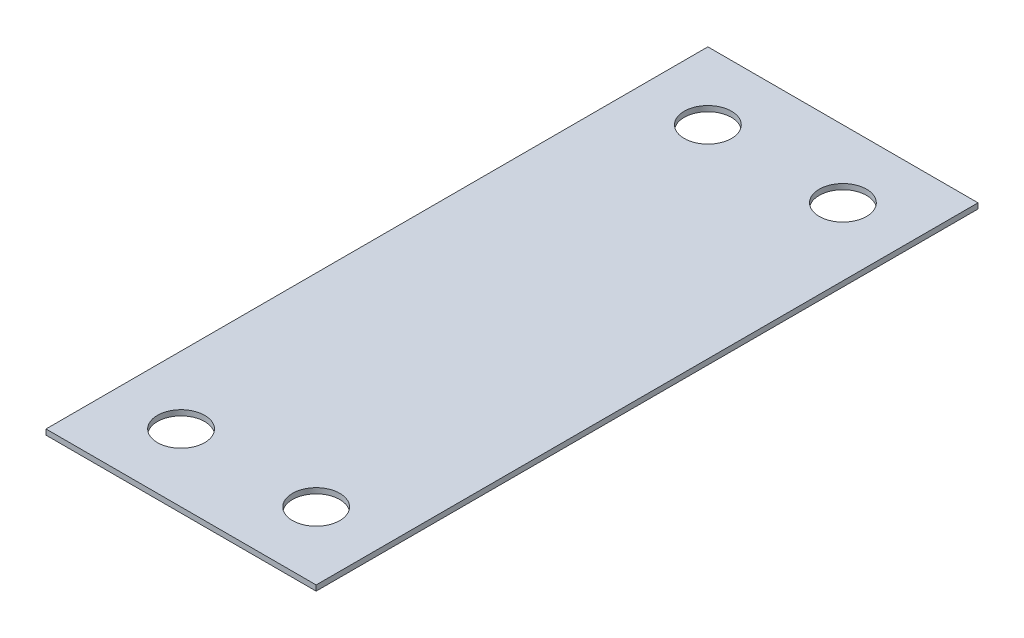
ISO-10303-21;
HEADER;
FILE_DESCRIPTION(('STEP AP214'),'2;1');
FILE_NAME('part.step','',(''),(''),'','','');
FILE_SCHEMA(('AUTOMOTIVE_DESIGN { 1 0 10303 214 1 1 1 1 }'));
ENDSEC;
DATA;
#1=APPLICATION_CONTEXT('core data for automotive mechanical design processes');
#2=APPLICATION_PROTOCOL_DEFINITION('international standard','automotive_design',2000,#1);
#3=PRODUCT_CONTEXT('',#1,'mechanical');
#4=PRODUCT('Part','Part','',(#3));
#5=PRODUCT_RELATED_PRODUCT_CATEGORY('part','',(#4));
#6=PRODUCT_DEFINITION_FORMATION('','',#4);
#7=PRODUCT_DEFINITION_CONTEXT('part definition',#1,'design');
#8=PRODUCT_DEFINITION('design','',#6,#7);
#9=PRODUCT_DEFINITION_SHAPE('','',#8);
#10=(LENGTH_UNIT() NAMED_UNIT(*) SI_UNIT(.MILLI.,.METRE.));
#11=(NAMED_UNIT(*) PLANE_ANGLE_UNIT() SI_UNIT($,.RADIAN.));
#12=(NAMED_UNIT(*) SI_UNIT($,.STERADIAN.) SOLID_ANGLE_UNIT());
#13=UNCERTAINTY_MEASURE_WITH_UNIT(LENGTH_MEASURE(1.E-05),#10,'distance_accuracy_value','');
#14=(GEOMETRIC_REPRESENTATION_CONTEXT(3) GLOBAL_UNCERTAINTY_ASSIGNED_CONTEXT((#13)) GLOBAL_UNIT_ASSIGNED_CONTEXT((#10,
#11,#12)) REPRESENTATION_CONTEXT('',''));
#15=CARTESIAN_POINT('',(0.,0.,0.));
#16=DIRECTION('',(0.,0.,1.));
#17=DIRECTION('',(1.,0.,0.));
#18=AXIS2_PLACEMENT_3D('',#15,#16,#17);
#19=CARTESIAN_POINT('',(0.,0.4,0.));
#20=DIRECTION('',(0.,1.,0.));
#21=DIRECTION('',(0.,0.,1.));
#22=AXIS2_PLACEMENT_3D('',#19,#20,#21);
#23=PLANE('',#22);
#24=CARTESIAN_POINT('',(15.,0.4,-5.));
#25=DIRECTION('',(0.,1.,0.));
#26=DIRECTION('',(0.,0.,1.));
#27=AXIS2_PLACEMENT_3D('',#24,#25,#26);
#28=CIRCLE('',#27,1.75);
#29=CARTESIAN_POINT('',(15.,0.4,-3.25));
#30=VERTEX_POINT('',#29);
#31=EDGE_CURVE('E127',#30,#30,#28,.T.);
#32=ORIENTED_EDGE('',*,*,#31,.F.);
#33=EDGE_LOOP('',(#32));
#34=FACE_BOUND('',#33,.T.);
#35=CARTESIAN_POINT('',(5.,0.4,-44.));
#36=DIRECTION('',(0.,1.,0.));
#37=DIRECTION('',(0.,0.,1.));
#38=AXIS2_PLACEMENT_3D('',#35,#36,#37);
#39=CIRCLE('',#38,1.75);
#40=CARTESIAN_POINT('',(5.,0.4,-42.25));
#41=VERTEX_POINT('',#40);
#42=EDGE_CURVE('E106',#41,#41,#39,.T.);
#43=ORIENTED_EDGE('',*,*,#42,.F.);
#44=EDGE_LOOP('',(#43));
#45=FACE_BOUND('',#44,.T.);
#46=DIRECTION('',(0.,0.,1.));
#47=VECTOR('',#46,1.);
#48=CARTESIAN_POINT('',(0.,0.4,-49.));
#49=LINE('',#48,#47);
#50=CARTESIAN_POINT('',(0.,0.4,-49.));
#51=VERTEX_POINT('',#50);
#52=CARTESIAN_POINT('',(0.,0.4,0.));
#53=VERTEX_POINT('',#52);
#54=EDGE_CURVE('E90',#51,#53,#49,.T.);
#55=ORIENTED_EDGE('',*,*,#54,.T.);
#56=DIRECTION('',(1.,0.,0.));
#57=VECTOR('',#56,1.);
#58=CARTESIAN_POINT('',(0.,0.4,0.));
#59=LINE('',#58,#57);
#60=CARTESIAN_POINT('',(20.,0.4,0.));
#61=VERTEX_POINT('',#60);
#62=EDGE_CURVE('E85',#53,#61,#59,.T.);
#63=ORIENTED_EDGE('',*,*,#62,.T.);
#64=DIRECTION('',(0.,0.,-1.));
#65=VECTOR('',#64,1.);
#66=CARTESIAN_POINT('',(20.,0.4,0.));
#67=LINE('',#66,#65);
#68=CARTESIAN_POINT('',(20.,0.4,-49.));
#69=VERTEX_POINT('',#68);
#70=EDGE_CURVE('E88',#61,#69,#67,.T.);
#71=ORIENTED_EDGE('',*,*,#70,.T.);
#72=DIRECTION('',(-1.,0.,0.));
#73=VECTOR('',#72,1.);
#74=CARTESIAN_POINT('',(20.,0.4,-49.));
#75=LINE('',#74,#73);
#76=EDGE_CURVE('E56',#69,#51,#75,.T.);
#77=ORIENTED_EDGE('',*,*,#76,.T.);
#78=EDGE_LOOP('',(#55,#63,#71,#77));
#79=FACE_BOUND('',#78,.T.);
#80=CARTESIAN_POINT('',(15.,0.4,-44.));
#81=DIRECTION('',(0.,1.,0.));
#82=DIRECTION('',(0.,0.,1.));
#83=AXIS2_PLACEMENT_3D('',#80,#81,#82);
#84=CIRCLE('',#83,1.75);
#85=CARTESIAN_POINT('',(15.,0.4,-42.25));
#86=VERTEX_POINT('',#85);
#87=EDGE_CURVE('E121',#86,#86,#84,.T.);
#88=ORIENTED_EDGE('',*,*,#87,.F.);
#89=EDGE_LOOP('',(#88));
#90=FACE_BOUND('',#89,.T.);
#91=CARTESIAN_POINT('',(5.00000000000001,0.4,-5.));
#92=DIRECTION('',(0.,1.,0.));
#93=DIRECTION('',(0.,0.,1.));
#94=AXIS2_PLACEMENT_3D('',#91,#92,#93);
#95=CIRCLE('',#94,1.75);
#96=CARTESIAN_POINT('',(5.00000000000001,0.4,-3.25));
#97=VERTEX_POINT('',#96);
#98=EDGE_CURVE('E133',#97,#97,#95,.T.);
#99=ORIENTED_EDGE('',*,*,#98,.F.);
#100=EDGE_LOOP('',(#99));
#101=FACE_BOUND('',#100,.T.);
#102=ADVANCED_FACE('F39',(#34,#45,#79,#90,#101),#23,.T.);
#103=CARTESIAN_POINT('',(0.,0.,0.));
#104=DIRECTION('',(0.,1.,0.));
#105=DIRECTION('',(0.,0.,1.));
#106=AXIS2_PLACEMENT_3D('',#103,#104,#105);
#107=PLANE('',#106);
#108=DIRECTION('',(0.,0.,1.));
#109=VECTOR('',#108,1.);
#110=CARTESIAN_POINT('',(0.,0.,-49.));
#111=LINE('',#110,#109);
#112=CARTESIAN_POINT('',(0.,0.,-49.));
#113=VERTEX_POINT('',#112);
#114=CARTESIAN_POINT('',(0.,0.,0.));
#115=VERTEX_POINT('',#114);
#116=EDGE_CURVE('E103',#113,#115,#111,.T.);
#117=ORIENTED_EDGE('',*,*,#116,.F.);
#118=DIRECTION('',(-1.,0.,0.));
#119=VECTOR('',#118,1.);
#120=CARTESIAN_POINT('',(20.,0.,-49.));
#121=LINE('',#120,#119);
#122=CARTESIAN_POINT('',(20.,0.,-49.));
#123=VERTEX_POINT('',#122);
#124=EDGE_CURVE('E78',#123,#113,#121,.T.);
#125=ORIENTED_EDGE('',*,*,#124,.F.);
#126=DIRECTION('',(0.,0.,-1.));
#127=VECTOR('',#126,1.);
#128=CARTESIAN_POINT('',(20.,0.,-35.));
#129=LINE('',#128,#127);
#130=CARTESIAN_POINT('',(20.,0.,0.));
#131=VERTEX_POINT('',#130);
#132=EDGE_CURVE('E72',#131,#123,#129,.T.);
#133=ORIENTED_EDGE('',*,*,#132,.F.);
#134=DIRECTION('',(1.,0.,0.));
#135=VECTOR('',#134,1.);
#136=CARTESIAN_POINT('',(0.,0.,0.));
#137=LINE('',#136,#135);
#138=EDGE_CURVE('E95',#115,#131,#137,.T.);
#139=ORIENTED_EDGE('',*,*,#138,.F.);
#140=EDGE_LOOP('',(#117,#125,#133,#139));
#141=FACE_BOUND('',#140,.T.);
#142=CARTESIAN_POINT('',(5.,0.,-44.));
#143=DIRECTION('',(0.,1.,0.));
#144=DIRECTION('',(0.,0.,1.));
#145=AXIS2_PLACEMENT_3D('',#142,#143,#144);
#146=CIRCLE('',#145,1.75);
#147=CARTESIAN_POINT('',(5.,0.,-42.25));
#148=VERTEX_POINT('',#147);
#149=EDGE_CURVE('E118',#148,#148,#146,.T.);
#150=ORIENTED_EDGE('',*,*,#149,.T.);
#151=EDGE_LOOP('',(#150));
#152=FACE_BOUND('',#151,.T.);
#153=CARTESIAN_POINT('',(15.,0.,-44.));
#154=DIRECTION('',(0.,1.,0.));
#155=DIRECTION('',(0.,0.,1.));
#156=AXIS2_PLACEMENT_3D('',#153,#154,#155);
#157=CIRCLE('',#156,1.75);
#158=CARTESIAN_POINT('',(15.,0.,-42.25));
#159=VERTEX_POINT('',#158);
#160=EDGE_CURVE('E124',#159,#159,#157,.T.);
#161=ORIENTED_EDGE('',*,*,#160,.T.);
#162=EDGE_LOOP('',(#161));
#163=FACE_BOUND('',#162,.T.);
#164=CARTESIAN_POINT('',(15.,0.,-5.));
#165=DIRECTION('',(0.,1.,0.));
#166=DIRECTION('',(0.,0.,1.));
#167=AXIS2_PLACEMENT_3D('',#164,#165,#166);
#168=CIRCLE('',#167,1.75);
#169=CARTESIAN_POINT('',(15.,0.,-3.25));
#170=VERTEX_POINT('',#169);
#171=EDGE_CURVE('E130',#170,#170,#168,.T.);
#172=ORIENTED_EDGE('',*,*,#171,.T.);
#173=EDGE_LOOP('',(#172));
#174=FACE_BOUND('',#173,.T.);
#175=CARTESIAN_POINT('',(5.00000000000001,0.,-5.));
#176=DIRECTION('',(0.,1.,0.));
#177=DIRECTION('',(0.,0.,1.));
#178=AXIS2_PLACEMENT_3D('',#175,#176,#177);
#179=CIRCLE('',#178,1.75);
#180=CARTESIAN_POINT('',(5.00000000000001,0.,-3.25));
#181=VERTEX_POINT('',#180);
#182=EDGE_CURVE('E136',#181,#181,#179,.T.);
#183=ORIENTED_EDGE('',*,*,#182,.T.);
#184=EDGE_LOOP('',(#183));
#185=FACE_BOUND('',#184,.T.);
#186=ADVANCED_FACE('F114',(#141,#152,#163,#174,#185),#107,.F.);
#187=CARTESIAN_POINT('',(0.,0.4,-49.));
#188=DIRECTION('',(1.,0.,0.));
#189=DIRECTION('',(0.,0.,-1.));
#190=AXIS2_PLACEMENT_3D('',#187,#188,#189);
#191=PLANE('',#190);
#192=ORIENTED_EDGE('',*,*,#116,.T.);
#193=DIRECTION('',(0.,-1.,0.));
#194=VECTOR('',#193,1.);
#195=CARTESIAN_POINT('',(0.,0.4,0.));
#196=LINE('',#195,#194);
#197=EDGE_CURVE('E11',#53,#115,#196,.T.);
#198=ORIENTED_EDGE('',*,*,#197,.F.);
#199=ORIENTED_EDGE('',*,*,#54,.F.);
#200=DIRECTION('',(0.,-1.,0.));
#201=VECTOR('',#200,1.);
#202=CARTESIAN_POINT('',(0.,0.4,-49.));
#203=LINE('',#202,#201);
#204=EDGE_CURVE('E99',#51,#113,#203,.T.);
#205=ORIENTED_EDGE('',*,*,#204,.T.);
#206=EDGE_LOOP('',(#192,#198,#199,#205));
#207=FACE_BOUND('',#206,.T.);
#208=ADVANCED_FACE('F41',(#207),#191,.F.);
#209=CARTESIAN_POINT('',(0.,0.4,0.));
#210=DIRECTION('',(0.,0.,-1.));
#211=DIRECTION('',(-1.,0.,0.));
#212=AXIS2_PLACEMENT_3D('',#209,#210,#211);
#213=PLANE('',#212);
#214=ORIENTED_EDGE('',*,*,#138,.T.);
#215=DIRECTION('',(0.,-1.,0.));
#216=VECTOR('',#215,1.);
#217=CARTESIAN_POINT('',(20.,0.4,0.));
#218=LINE('',#217,#216);
#219=EDGE_CURVE('E48',#61,#131,#218,.T.);
#220=ORIENTED_EDGE('',*,*,#219,.F.);
#221=ORIENTED_EDGE('',*,*,#62,.F.);
#222=ORIENTED_EDGE('',*,*,#197,.T.);
#223=EDGE_LOOP('',(#214,#220,#221,#222));
#224=FACE_BOUND('',#223,.T.);
#225=ADVANCED_FACE('F94',(#224),#213,.F.);
#226=CARTESIAN_POINT('',(20.,0.4,-35.));
#227=DIRECTION('',(-1.,0.,0.));
#228=DIRECTION('',(0.,0.,1.));
#229=AXIS2_PLACEMENT_3D('',#226,#227,#228);
#230=PLANE('',#229);
#231=ORIENTED_EDGE('',*,*,#132,.T.);
#232=DIRECTION('',(0.,-1.,0.));
#233=VECTOR('',#232,1.);
#234=CARTESIAN_POINT('',(20.,0.4,-49.));
#235=LINE('',#234,#233);
#236=EDGE_CURVE('E96',#69,#123,#235,.T.);
#237=ORIENTED_EDGE('',*,*,#236,.F.);
#238=ORIENTED_EDGE('',*,*,#70,.F.);
#239=ORIENTED_EDGE('',*,*,#219,.T.);
#240=EDGE_LOOP('',(#231,#237,#238,#239));
#241=FACE_BOUND('',#240,.T.);
#242=ADVANCED_FACE('F97',(#241),#230,.F.);
#243=CARTESIAN_POINT('',(20.,0.4,-49.));
#244=DIRECTION('',(0.,0.,1.));
#245=DIRECTION('',(1.,0.,0.));
#246=AXIS2_PLACEMENT_3D('',#243,#244,#245);
#247=PLANE('',#246);
#248=ORIENTED_EDGE('',*,*,#124,.T.);
#249=ORIENTED_EDGE('',*,*,#204,.F.);
#250=ORIENTED_EDGE('',*,*,#76,.F.);
#251=ORIENTED_EDGE('',*,*,#236,.T.);
#252=EDGE_LOOP('',(#248,#249,#250,#251));
#253=FACE_BOUND('',#252,.T.);
#254=ADVANCED_FACE('F111',(#253),#247,.F.);
#255=CARTESIAN_POINT('',(5.,0.4,-44.));
#256=DIRECTION('',(0.,-1.,0.));
#257=DIRECTION('',(0.,0.,-1.));
#258=AXIS2_PLACEMENT_3D('',#255,#256,#257);
#259=CYLINDRICAL_SURFACE('',#258,1.75);
#260=ORIENTED_EDGE('',*,*,#42,.T.);
#261=EDGE_LOOP('',(#260));
#262=FACE_BOUND('',#261,.T.);
#263=ORIENTED_EDGE('',*,*,#149,.F.);
#264=EDGE_LOOP('',(#263));
#265=FACE_BOUND('',#264,.T.);
#266=ADVANCED_FACE('F155',(#262,#265),#259,.F.);
#267=CARTESIAN_POINT('',(15.,0.4,-44.));
#268=DIRECTION('',(0.,-1.,0.));
#269=DIRECTION('',(0.,0.,-1.));
#270=AXIS2_PLACEMENT_3D('',#267,#268,#269);
#271=CYLINDRICAL_SURFACE('',#270,1.75);
#272=ORIENTED_EDGE('',*,*,#87,.T.);
#273=EDGE_LOOP('',(#272));
#274=FACE_BOUND('',#273,.T.);
#275=ORIENTED_EDGE('',*,*,#160,.F.);
#276=EDGE_LOOP('',(#275));
#277=FACE_BOUND('',#276,.T.);
#278=ADVANCED_FACE('F202',(#274,#277),#271,.F.);
#279=CARTESIAN_POINT('',(15.,0.4,-5.));
#280=DIRECTION('',(0.,-1.,0.));
#281=DIRECTION('',(0.,0.,-1.));
#282=AXIS2_PLACEMENT_3D('',#279,#280,#281);
#283=CYLINDRICAL_SURFACE('',#282,1.75);
#284=ORIENTED_EDGE('',*,*,#31,.T.);
#285=EDGE_LOOP('',(#284));
#286=FACE_BOUND('',#285,.T.);
#287=ORIENTED_EDGE('',*,*,#171,.F.);
#288=EDGE_LOOP('',(#287));
#289=FACE_BOUND('',#288,.T.);
#290=ADVANCED_FACE('F210',(#286,#289),#283,.F.);
#291=CARTESIAN_POINT('',(5.00000000000001,0.4,-5.));
#292=DIRECTION('',(0.,-1.,0.));
#293=DIRECTION('',(0.,0.,-1.));
#294=AXIS2_PLACEMENT_3D('',#291,#292,#293);
#295=CYLINDRICAL_SURFACE('',#294,1.75);
#296=ORIENTED_EDGE('',*,*,#98,.T.);
#297=EDGE_LOOP('',(#296));
#298=FACE_BOUND('',#297,.T.);
#299=ORIENTED_EDGE('',*,*,#182,.F.);
#300=EDGE_LOOP('',(#299));
#301=FACE_BOUND('',#300,.T.);
#302=ADVANCED_FACE('F142',(#298,#301),#295,.F.);
#303=CLOSED_SHELL('',(#102,#186,#208,#225,#242,#254,#266,#278,#290,#302));
#304=MANIFOLD_SOLID_BREP('B2',#303);
#305=ADVANCED_BREP_SHAPE_REPRESENTATION('',(#18,#304),#14);
#306=SHAPE_DEFINITION_REPRESENTATION(#9,#305);
ENDSEC;
END-ISO-10303-21;
